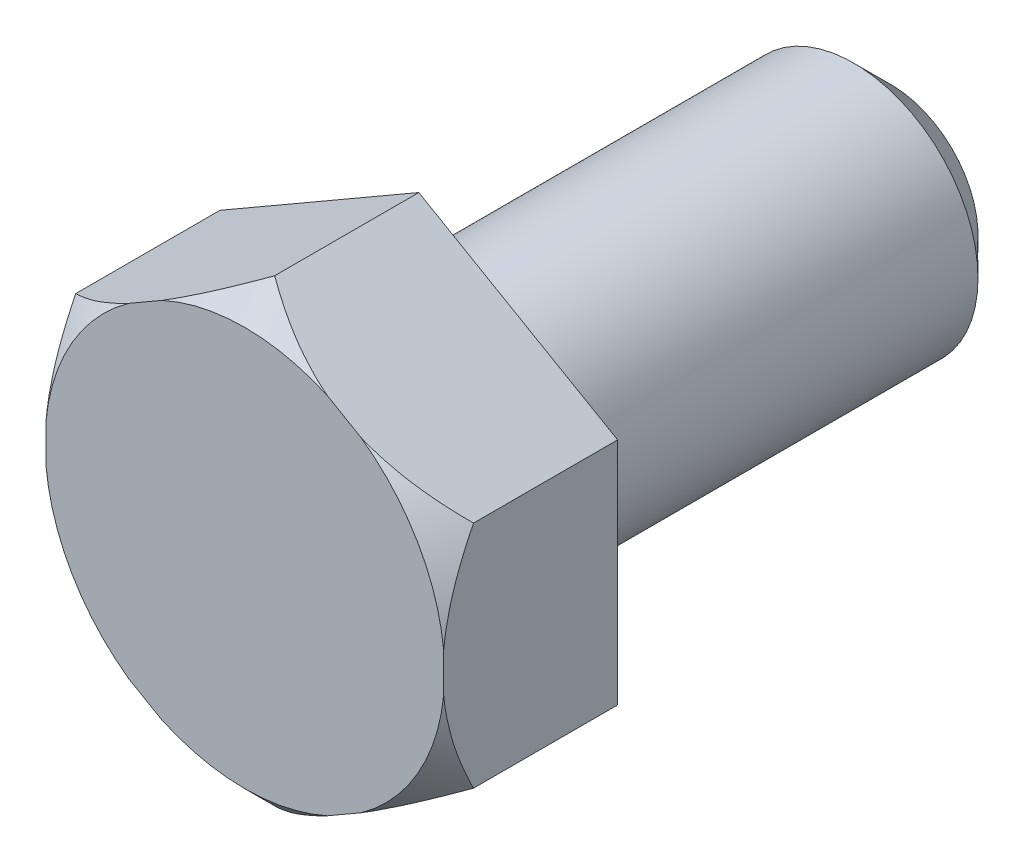
ISO-10303-21;
HEADER;
FILE_DESCRIPTION(('STEP AP214'),'2;1');
FILE_NAME('part.step','',(''),(''),'','','');
FILE_SCHEMA(('AUTOMOTIVE_DESIGN { 1 0 10303 214 1 1 1 1 }'));
ENDSEC;
DATA;
#1=APPLICATION_CONTEXT('core data for automotive mechanical design processes');
#2=APPLICATION_PROTOCOL_DEFINITION('international standard','automotive_design',2000,#1);
#3=PRODUCT_CONTEXT('',#1,'mechanical');
#4=PRODUCT('Part','Part','',(#3));
#5=PRODUCT_RELATED_PRODUCT_CATEGORY('part','',(#4));
#6=PRODUCT_DEFINITION_FORMATION('','',#4);
#7=PRODUCT_DEFINITION_CONTEXT('part definition',#1,'design');
#8=PRODUCT_DEFINITION('design','',#6,#7);
#9=PRODUCT_DEFINITION_SHAPE('','',#8);
#10=(LENGTH_UNIT() NAMED_UNIT(*) SI_UNIT(.MILLI.,.METRE.));
#11=(NAMED_UNIT(*) PLANE_ANGLE_UNIT() SI_UNIT($,.RADIAN.));
#12=(NAMED_UNIT(*) SI_UNIT($,.STERADIAN.) SOLID_ANGLE_UNIT());
#13=UNCERTAINTY_MEASURE_WITH_UNIT(LENGTH_MEASURE(1.E-05),#10,'distance_accuracy_value','');
#14=(GEOMETRIC_REPRESENTATION_CONTEXT(3) GLOBAL_UNCERTAINTY_ASSIGNED_CONTEXT((#13)) GLOBAL_UNIT_ASSIGNED_CONTEXT((#10,
#11,#12)) REPRESENTATION_CONTEXT('',''));
#15=CARTESIAN_POINT('',(0.,0.,0.));
#16=DIRECTION('',(0.,0.,1.));
#17=DIRECTION('',(1.,0.,0.));
#18=AXIS2_PLACEMENT_3D('',#15,#16,#17);
#19=CARTESIAN_POINT('',(4.,2.3094010767585,3.5));
#20=DIRECTION('',(-0.5,-0.866025403784439,0.));
#21=DIRECTION('',(0.866025403784439,-0.5,0.));
#22=AXIS2_PLACEMENT_3D('',#19,#20,#21);
#23=PLANE('',#22);
#24=CARTESIAN_POINT('',(6.79476615595337,0.695842084296772,0.688498842508936));
#25=CARTESIAN_POINT('',(6.70000930950614,0.750549975100642,0.777178889698006));
#26=CARTESIAN_POINT('',(6.60487696818238,0.805474657972554,0.865328805815428));
#27=CARTESIAN_POINT('',(6.41373130740638,0.915832656676006,1.04036549943733));
#28=CARTESIAN_POINT('',(6.31771790950577,0.971266017799732,1.12725216264761));
#29=CARTESIAN_POINT('',(6.12446943592377,1.08283807604278,1.29974670383616));
#30=CARTESIAN_POINT('',(6.02723201228358,1.13897812875675,1.3853510809342));
#31=CARTESIAN_POINT('',(5.83161129676517,1.25191980152038,1.55479243710794));
#32=CARTESIAN_POINT('',(5.73322803576278,1.30872140374386,1.63862946363658));
#33=CARTESIAN_POINT('',(5.53240733494921,1.42466528941742,1.80647993203772));
#34=CARTESIAN_POINT('',(5.42993290458804,1.48382892937149,1.89043450768313));
#35=CARTESIAN_POINT('',(5.22336762687931,1.60308944806186,2.05564703273477));
#36=CARTESIAN_POINT('',(5.11927684103641,1.66318629128842,2.13690508438033));
#37=CARTESIAN_POINT('',(4.90930432500162,1.78441397994353,2.296059302661));
#38=CARTESIAN_POINT('',(4.80342418614574,1.84554390661381,2.37395825807572));
#39=CARTESIAN_POINT('',(4.58950641557992,1.96904938903442,2.52568435543538));
#40=CARTESIAN_POINT('',(4.48146905777372,2.03142478664637,2.59951200989462));
#41=CARTESIAN_POINT('',(4.26003493090071,2.15926983940428,2.74398038586472));
#42=CARTESIAN_POINT('',(4.14657191939889,2.22477773963792,2.81448663246692));
#43=CARTESIAN_POINT('',(3.9166598559198,2.35751753137751,2.94879092757608));
#44=CARTESIAN_POINT('',(3.80021038046368,2.42474966737909,3.01258801811329));
#45=CARTESIAN_POINT('',(3.56470492494815,2.56071880551661,3.13137401588992));
#46=CARTESIAN_POINT('',(3.4456664125482,2.62944572269465,3.1864086204148));
#47=CARTESIAN_POINT('',(3.20431828364179,2.76878812988718,3.28596217144072));
#48=CARTESIAN_POINT('',(3.08200966935891,2.83940304126761,3.3304842996045));
#49=CARTESIAN_POINT('',(2.85867948034043,2.9683427860156,3.39923411057011));
#50=CARTESIAN_POINT('',(2.75818433873892,3.02636368307148,3.42572915166482));
#51=CARTESIAN_POINT('',(2.55566412494509,3.14328878302169,3.46929589304856));
#52=CARTESIAN_POINT('',(2.45363927724055,3.20219285630793,3.48636896239549));
#53=CARTESIAN_POINT('',(2.24886078375985,3.32042177464326,3.5102149877651));
#54=CARTESIAN_POINT('',(2.1461087531537,3.3797456871735,3.51700617374364));
#55=CARTESIAN_POINT('',(1.94048660436699,3.49846169012686,3.51997326136445));
#56=CARTESIAN_POINT('',(1.83761648501932,3.55785378122381,3.51614905717223));
#57=CARTESIAN_POINT('',(1.63284237937224,3.67608016624221,3.49812146490399));
#58=CARTESIAN_POINT('',(1.53093657012821,3.73491551264124,3.48394524346901));
#59=CARTESIAN_POINT('',(1.32847344421937,3.85180765288568,3.44597172288278));
#60=CARTESIAN_POINT('',(1.22791645295816,3.90986425885924,3.42217214373416));
#61=CARTESIAN_POINT('',(1.02833782876811,4.02509103125986,3.36593528936384));
#62=CARTESIAN_POINT('',(0.929321612705897,4.08225807025752,3.33347269032111));
#63=CARTESIAN_POINT('',(0.733368076426664,4.19539189717699,3.26114482396495));
#64=CARTESIAN_POINT('',(0.636430659316713,4.25135874103997,3.22127990251436));
#65=CARTESIAN_POINT('',(0.410702029931545,4.3816832259793,3.12008468151808));
#66=CARTESIAN_POINT('',(0.282789045109983,4.45553382219888,3.05615257560101));
#67=CARTESIAN_POINT('',(0.0305742576020006,4.60115009766022,2.91934821347807));
#68=CARTESIAN_POINT('',(-0.0937255940730358,4.67291465048503,2.84647123421822));
#69=CARTESIAN_POINT('',(-0.33932165060919,4.81470959983809,2.69363109681433));
#70=CARTESIAN_POINT('',(-0.460611085966398,4.88473608799143,2.61365354526049));
#71=CARTESIAN_POINT('',(-0.700341416762302,5.02314445900936,2.4482849873107));
#72=CARTESIAN_POINT('',(-0.818782807502472,5.09152662783639,2.36289493172991));
#73=CARTESIAN_POINT('',(-1.05380077504799,5.2272143146632,2.18743214406013));
#74=CARTESIAN_POINT('',(-1.17036619922115,5.29451339368778,2.09733958859257));
#75=CARTESIAN_POINT('',(-1.401448302179,5.42792870803539,1.91370612321396));
#76=CARTESIAN_POINT('',(-1.51596480893443,5.4940448440373,1.82016492575063));
#77=CARTESIAN_POINT('',(-1.74312962952717,5.62519851435693,1.63040915873426));
#78=CARTESIAN_POINT('',(-1.85577983998467,5.69023714368883,1.53419760780065));
#79=CARTESIAN_POINT('',(-2.07960308284001,5.81946155320226,1.33950918066551));
#80=CARTESIAN_POINT('',(-2.19077608463863,5.88364731571731,1.24103225765361));
#81=CARTESIAN_POINT('',(-2.38440042361704,5.99543637994816,1.06690301959028));
#82=CARTESIAN_POINT('',(-2.46712669446055,6.04319841468872,0.991657221213363));
#83=CARTESIAN_POINT('',(-2.63158175091155,6.1381465858003,0.840569635092686));
#84=CARTESIAN_POINT('',(-2.71331331369694,6.18533432557573,0.764731879594086));
#85=CARTESIAN_POINT('',(-2.79476615595337,6.23236114597874,0.688498842508936));
#86=B_SPLINE_CURVE_WITH_KNOTS('',3,(#24,#25,#26,#27,#28,#29,#30,#31,#32,#33,#34,#35,#36,#37,#38,
#39,#40,#41,#42,#43,#44,#45,#46,#47,#48,#49,#50,#51,#52,#53,#54,#55,#56,#57,#58,#59,#60,#61,#62,
#63,#64,#65,#66,#67,#68,#69,#70,#71,#72,#73,#74,#75,#76,#77,#78,#79,#80,#81,#82,#83,#84,#85),
.UNSPECIFIED.,.F.,.F.,(4,2,2,2,2,2,2,2,2,2,2,2,2,2,2,2,2,2,2,2,2,2,2,2,2,2,2,2,2,2,4),(0.,
0.422523486268595,0.845084965857707,1.26864344611915,1.69219053941843,2.12741530840039,
2.56262355683649,2.99746324351266,3.43224806500054,3.87844266671117,4.32470089225512,
4.76854968510423,5.21226397182493,5.56900884091926,5.92570185960707,6.28176171176553,
6.63782511382167,6.99295744690877,7.3481739684557,7.70444045781147,8.06069030531606,
8.54311709558823,9.02579972065671,9.50948415192898,9.9930838485381,10.4789192678291,
10.9647952887419,11.450142801227,11.9355003516845,12.3002974848988,12.6635031299856),.UNSPECIFIED.);
#87=CARTESIAN_POINT('',(4.,2.3094010767585,2.9));
#88=VERTEX_POINT('',#87);
#89=CARTESIAN_POINT('',(2.33627081621023,3.26995556887816,3.5));
#90=VERTEX_POINT('',#89);
#91=EDGE_CURVE('E120',#88,#90,#86,.T.);
#92=ORIENTED_EDGE('',*,*,#91,.F.);
#93=DIRECTION('',(0.,0.,-1.));
#94=VECTOR('',#93,1.);
#95=CARTESIAN_POINT('',(4.,2.3094010767585,3.5));
#96=LINE('',#95,#94);
#97=CARTESIAN_POINT('',(4.,2.3094010767585,0.));
#98=VERTEX_POINT('',#97);
#99=EDGE_CURVE('E131',#88,#98,#96,.T.);
#100=ORIENTED_EDGE('',*,*,#99,.T.);
#101=DIRECTION('',(-0.866025403784439,0.5,0.));
#102=VECTOR('',#101,1.);
#103=CARTESIAN_POINT('',(4.,2.3094010767585,0.));
#104=LINE('',#103,#102);
#105=CARTESIAN_POINT('',(0.,4.61880215351701,0.));
#106=VERTEX_POINT('',#105);
#107=EDGE_CURVE('E210',#98,#106,#104,.T.);
#108=ORIENTED_EDGE('',*,*,#107,.T.);
#109=DIRECTION('',(0.,0.,-1.));
#110=VECTOR('',#109,1.);
#111=CARTESIAN_POINT('',(0.,4.61880215351701,3.5));
#112=LINE('',#111,#110);
#113=CARTESIAN_POINT('',(0.,4.61880215351701,2.9));
#114=VERTEX_POINT('',#113);
#115=EDGE_CURVE('E156',#114,#106,#112,.T.);
#116=ORIENTED_EDGE('',*,*,#115,.F.);
#117=CARTESIAN_POINT('',(1.66372918378976,3.65824766139735,3.5));
#118=VERTEX_POINT('',#117);
#119=EDGE_CURVE('E137',#118,#114,#86,.T.);
#120=ORIENTED_EDGE('',*,*,#119,.F.);
#121=DIRECTION('',(-0.866025403784439,0.5,0.));
#122=VECTOR('',#121,1.);
#123=CARTESIAN_POINT('',(4.,2.3094010767585,3.5));
#124=LINE('',#123,#122);
#125=EDGE_CURVE('E135',#90,#118,#124,.T.);
#126=ORIENTED_EDGE('',*,*,#125,.F.);
#127=EDGE_LOOP('',(#92,#100,#108,#116,#120,#126));
#128=FACE_BOUND('',#127,.T.);
#129=ADVANCED_FACE('F29',(#128),#23,.F.);
#130=CARTESIAN_POINT('',(0.,4.61880215351701,3.5));
#131=DIRECTION('',(0.5,-0.866025403784438,0.));
#132=DIRECTION('',(0.866025403784439,0.5,0.));
#133=AXIS2_PLACEMENT_3D('',#130,#131,#132);
#134=PLANE('',#133);
#135=CARTESIAN_POINT('',(2.79476615595337,6.23236114597874,0.688498842508935));
#136=CARTESIAN_POINT('',(2.70000930950614,6.17765325517487,0.777178889698004));
#137=CARTESIAN_POINT('',(2.60487696818238,6.12272857230296,0.865328805815427));
#138=CARTESIAN_POINT('',(2.41373130740638,6.01237057359951,1.04036549943733));
#139=CARTESIAN_POINT('',(2.31771790950577,5.95693721247578,1.12725216264761));
#140=CARTESIAN_POINT('',(2.12446943592377,5.84536515423273,1.29974670383616));
#141=CARTESIAN_POINT('',(2.02723201228359,5.78922510151876,1.3853510809342));
#142=CARTESIAN_POINT('',(1.83161129676517,5.67628342875514,1.55479243710794));
#143=CARTESIAN_POINT('',(1.73322803576278,5.61948182653165,1.63862946363657));
#144=CARTESIAN_POINT('',(1.53240733494921,5.50353794085809,1.80647993203772));
#145=CARTESIAN_POINT('',(1.42993290458804,5.44437430090402,1.89043450768313));
#146=CARTESIAN_POINT('',(1.22336762687931,5.32511378221365,2.05564703273477));
#147=CARTESIAN_POINT('',(1.11927684103641,5.26501693898709,2.13690508438033));
#148=CARTESIAN_POINT('',(0.909304325001625,5.14378925033199,2.296059302661));
#149=CARTESIAN_POINT('',(0.803424186145741,5.08265932366171,2.37395825807572));
#150=CARTESIAN_POINT('',(0.589506415579928,4.95915384124109,2.52568435543538));
#151=CARTESIAN_POINT('',(0.481469057773723,4.89677844362914,2.59951200989462));
#152=CARTESIAN_POINT('',(0.260034930900709,4.76893339087124,2.74398038586472));
#153=CARTESIAN_POINT('',(0.146571919398891,4.7034254906376,2.81448663246692));
#154=CARTESIAN_POINT('',(-0.0833401440801969,4.570685698898,2.94879092757608));
#155=CARTESIAN_POINT('',(-0.199789619536315,4.50345356289642,3.01258801811329));
#156=CARTESIAN_POINT('',(-0.435295075051851,4.3674844247589,3.13137401588992));
#157=CARTESIAN_POINT('',(-0.554333587451798,4.29875750758086,3.1864086204148));
#158=CARTESIAN_POINT('',(-0.795681716358207,4.15941510038833,3.28596217144072));
#159=CARTESIAN_POINT('',(-0.917990330641092,4.0888001890079,3.3304842996045));
#160=CARTESIAN_POINT('',(-1.14132051965957,3.95986044425991,3.39923411057011));
#161=CARTESIAN_POINT('',(-1.24181566126108,3.90183954720403,3.42572915166482));
#162=CARTESIAN_POINT('',(-1.44433587505491,3.78491444725382,3.46929589304856));
#163=CARTESIAN_POINT('',(-1.54636072275944,3.72601037396758,3.48636896239549));
#164=CARTESIAN_POINT('',(-1.75113921624014,3.60778145563225,3.5102149877651));
#165=CARTESIAN_POINT('',(-1.85389124684629,3.54845754310201,3.51700617374364));
#166=CARTESIAN_POINT('',(-2.059513395633,3.42974154014865,3.51997326136445));
#167=CARTESIAN_POINT('',(-2.16238351498068,3.3703494490517,3.51614905717223));
#168=CARTESIAN_POINT('',(-2.36715762062776,3.2521230640333,3.49812146490399));
#169=CARTESIAN_POINT('',(-2.46906342987178,3.19328771763427,3.48394524346901));
#170=CARTESIAN_POINT('',(-2.67152655578062,3.07639557738983,3.44597172288278));
#171=CARTESIAN_POINT('',(-2.77208354704184,3.01833897141627,3.42217214373416));
#172=CARTESIAN_POINT('',(-2.97166217123189,2.90311219901565,3.36593528936385));
#173=CARTESIAN_POINT('',(-3.0706783872941,2.84594516001799,3.33347269032111));
#174=CARTESIAN_POINT('',(-3.26663192357333,2.73281133309852,3.26114482396495));
#175=CARTESIAN_POINT('',(-3.36356934068328,2.67684448923554,3.22127990251437));
#176=CARTESIAN_POINT('',(-3.58929797006845,2.54652000429621,3.12008468151809));
#177=CARTESIAN_POINT('',(-3.71721095489001,2.47266940807663,3.05615257560101));
#178=CARTESIAN_POINT('',(-3.96942574239799,2.32705313261529,2.91934821347808));
#179=CARTESIAN_POINT('',(-4.09372559407303,2.25528857979048,2.84647123421822));
#180=CARTESIAN_POINT('',(-4.33932165060918,2.11349363043742,2.69363109681434));
#181=CARTESIAN_POINT('',(-4.46061108596639,2.04346714228408,2.61365354526049));
#182=CARTESIAN_POINT('',(-4.70034141676229,1.90505877126615,2.4482849873107));
#183=CARTESIAN_POINT('',(-4.81878280750246,1.83667660243912,2.36289493172991));
#184=CARTESIAN_POINT('',(-5.05380077504798,1.70098891561231,2.18743214406013));
#185=CARTESIAN_POINT('',(-5.17036619922115,1.63368983658773,2.09733958859257));
#186=CARTESIAN_POINT('',(-5.40144830217899,1.50027452224012,1.91370612321397));
#187=CARTESIAN_POINT('',(-5.51596480893442,1.43415838623821,1.82016492575063));
#188=CARTESIAN_POINT('',(-5.74312962952716,1.30300471591858,1.63040915873427));
#189=CARTESIAN_POINT('',(-5.85577983998466,1.23796608658668,1.53419760780066));
#190=CARTESIAN_POINT('',(-6.07960308284,1.10874167707325,1.33950918066552));
#191=CARTESIAN_POINT('',(-6.19077608463861,1.0445559145582,1.24103225765362));
#192=CARTESIAN_POINT('',(-6.38440042361703,0.932766850327349,1.06690301959029));
#193=CARTESIAN_POINT('',(-6.46712669446054,0.885004815586794,0.991657221213369));
#194=CARTESIAN_POINT('',(-6.63158175091155,0.790056644475211,0.840569635092688));
#195=CARTESIAN_POINT('',(-6.71331331369694,0.742868904699777,0.764731879594086));
#196=CARTESIAN_POINT('',(-6.79476615595337,0.695842084296767,0.688498842508936));
#197=B_SPLINE_CURVE_WITH_KNOTS('',3,(#135,#136,#137,#138,#139,#140,#141,#142,#143,#144,#145,
#146,#147,#148,#149,#150,#151,#152,#153,#154,#155,#156,#157,#158,#159,#160,#161,#162,#163,#164,
#165,#166,#167,#168,#169,#170,#171,#172,#173,#174,#175,#176,#177,#178,#179,#180,#181,#182,#183,
#184,#185,#186,#187,#188,#189,#190,#191,#192,#193,#194,#195,#196),.UNSPECIFIED.,.F.,.F.,(4,2,2,
2,2,2,2,2,2,2,2,2,2,2,2,2,2,2,2,2,2,2,2,2,2,2,2,2,2,2,4),(0.,0.422523486268594,
0.845084965857706,1.26864344611915,1.69219053941843,2.12741530840039,2.56262355683649,
2.99746324351266,3.43224806500054,3.87844266671116,4.32470089225512,4.76854968510423,
5.21226397182493,5.56900884091926,5.92570185960707,6.28176171176553,6.63782511382167,
6.99295744690877,7.3481739684557,7.70444045781147,8.06069030531606,8.54311709558823,
9.02579972065671,9.50948415192898,9.9930838485381,10.4789192678291,10.9647952887419,
11.450142801227,11.9355003516845,12.3002974848988,12.6635031299856),.UNSPECIFIED.);
#198=CARTESIAN_POINT('',(-1.66372918378976,3.65824766139735,3.5));
#199=VERTEX_POINT('',#198);
#200=EDGE_CURVE('E218',#114,#199,#197,.T.);
#201=ORIENTED_EDGE('',*,*,#200,.F.);
#202=ORIENTED_EDGE('',*,*,#115,.T.);
#203=DIRECTION('',(-0.866025403784438,-0.5,0.));
#204=VECTOR('',#203,1.);
#205=CARTESIAN_POINT('',(0.,4.61880215351701,0.));
#206=LINE('',#205,#204);
#207=CARTESIAN_POINT('',(-4.,2.3094010767585,0.));
#208=VERTEX_POINT('',#207);
#209=EDGE_CURVE('E207',#106,#208,#206,.T.);
#210=ORIENTED_EDGE('',*,*,#209,.T.);
#211=DIRECTION('',(0.,0.,-1.));
#212=VECTOR('',#211,1.);
#213=CARTESIAN_POINT('',(-4.,2.3094010767585,3.5));
#214=LINE('',#213,#212);
#215=CARTESIAN_POINT('',(-4.,2.3094010767585,2.9));
#216=VERTEX_POINT('',#215);
#217=EDGE_CURVE('E154',#216,#208,#214,.T.);
#218=ORIENTED_EDGE('',*,*,#217,.F.);
#219=CARTESIAN_POINT('',(-2.33627081621024,3.26995556887815,3.5));
#220=VERTEX_POINT('',#219);
#221=EDGE_CURVE('E212',#220,#216,#197,.T.);
#222=ORIENTED_EDGE('',*,*,#221,.F.);
#223=DIRECTION('',(-0.866025403784438,-0.5,0.));
#224=VECTOR('',#223,1.);
#225=CARTESIAN_POINT('',(0.,4.61880215351701,3.5));
#226=LINE('',#225,#224);
#227=EDGE_CURVE('E194',#199,#220,#226,.T.);
#228=ORIENTED_EDGE('',*,*,#227,.F.);
#229=EDGE_LOOP('',(#201,#202,#210,#218,#222,#228));
#230=FACE_BOUND('',#229,.T.);
#231=ADVANCED_FACE('F226',(#230),#134,.F.);
#232=CARTESIAN_POINT('',(-4.,2.3094010767585,3.5));
#233=DIRECTION('',(1.,0.,0.));
#234=DIRECTION('',(0.,1.,0.));
#235=AXIS2_PLACEMENT_3D('',#232,#233,#234);
#236=PLANE('',#235);
#237=CARTESIAN_POINT('',(-4.,5.10416723271187,1.03401047301642));
#238=CARTESIAN_POINT('',(-4.,4.9898588262799,1.12396648712248));
#239=CARTESIAN_POINT('',(-4.,4.87500222403636,1.21323480572489));
#240=CARTESIAN_POINT('',(-4.,4.64398100830827,1.39010065461611));
#241=CARTESIAN_POINT('',(-4.,4.52781618373569,1.47769790894519));
#242=CARTESIAN_POINT('',(-4.,4.29341594348141,1.6513323356686));
#243=CARTESIAN_POINT('',(-4.,4.17517305003121,1.73735943976961));
#244=CARTESIAN_POINT('',(-4.,3.93695487059267,1.90697407264146));
#245=CARTESIAN_POINT('',(-4.,3.81697966748713,1.99056171755454));
#246=CARTESIAN_POINT('',(-4.,3.56903053988056,2.15883212778891));
#247=CARTESIAN_POINT('',(-4.,3.44095437037389,2.24336480540375));
#248=CARTESIAN_POINT('',(-4.,3.18221357615381,2.40836670985872));
#249=CARTESIAN_POINT('',(-4.,3.05154916715139,2.48883627336257));
#250=CARTESIAN_POINT('',(-4.,2.7874476092969,2.6445324081336));
#251=CARTESIAN_POINT('',(-4.,2.65401614902953,2.71976857302015));
#252=CARTESIAN_POINT('',(-4.,2.38373289021929,2.86379345674663));
#253=CARTESIAN_POINT('',(-4.,2.24688202766041,2.93258391598543));
#254=CARTESIAN_POINT('',(-4.,1.98367043923717,3.05530153135103));
#255=CARTESIAN_POINT('',(-4.,1.85768607919076,3.11002999939294));
#256=CARTESIAN_POINT('',(-4.,1.60243753593935,3.21135635365713));
#257=CARTESIAN_POINT('',(-4.,1.47317303987091,3.25795346093595));
#258=CARTESIAN_POINT('',(-4.,1.21292441705818,3.34074586733072));
#259=CARTESIAN_POINT('',(-4.,1.08197637095356,3.37705304471776));
#260=CARTESIAN_POINT('',(-4.,0.817433071402948,3.43815768072446));
#261=CARTESIAN_POINT('',(-4.,0.683838902497328,3.46295975705223));
#262=CARTESIAN_POINT('',(-4.,0.412316048728752,3.49989685857687));
#263=CARTESIAN_POINT('',(-4.,0.274353076380333,3.51178529673611));
#264=CARTESIAN_POINT('',(-4.,-0.00205892664185706,3.52118634522706));
#265=CARTESIAN_POINT('',(-4.,-0.140507912440202,3.51870024964367));
#266=CARTESIAN_POINT('',(-4.,-0.416814625689941,3.49951454323253));
#267=CARTESIAN_POINT('',(-4.,-0.554669343917948,3.48277242008026));
#268=CARTESIAN_POINT('',(-4.,-0.828137115961054,3.43620184928348));
#269=CARTESIAN_POINT('',(-4.,-0.963749558031617,3.40636988962308));
#270=CARTESIAN_POINT('',(-4.,-1.27307598794308,3.32450160228564));
#271=CARTESIAN_POINT('',(-4.,-1.44572159053212,3.26846152909961));
#272=CARTESIAN_POINT('',(-4.,-1.78533180367642,3.14129797447849));
#273=CARTESIAN_POINT('',(-4.,-1.95229295544584,3.07016549368022));
#274=CARTESIAN_POINT('',(-4.,-2.28202183378059,2.915951609777));
#275=CARTESIAN_POINT('',(-4.,-2.44474983911879,2.83278642195294));
#276=CARTESIAN_POINT('',(-4.,-2.76538092127963,2.65780460696018));
#277=CARTESIAN_POINT('',(-4.,-2.92328510556265,2.56598998561201));
#278=CARTESIAN_POINT('',(-4.,-3.25793446497207,2.36185945664941));
#279=CARTESIAN_POINT('',(-4.,-3.43404610324972,2.24851177217482));
#280=CARTESIAN_POINT('',(-4.,-3.78201930426931,2.01543949003394));
#281=CARTESIAN_POINT('',(-4.,-3.95387990035834,1.89571346115211));
#282=CARTESIAN_POINT('',(-4.,-4.29033684017848,1.65419733400948));
#283=CARTESIAN_POINT('',(-4.,-4.45500968062294,1.53251336835331));
#284=CARTESIAN_POINT('',(-4.,-4.69993893406992,1.34736923817687));
#285=CARTESIAN_POINT('',(-4.,-4.78120758789535,1.28524011601032));
#286=CARTESIAN_POINT('',(-4.,-4.94313113165496,1.16019346744187));
#287=CARTESIAN_POINT('',(-4.,-5.02378604589967,1.09727597253186));
#288=CARTESIAN_POINT('',(-4.,-5.10416723271188,1.03401047301642));
#289=B_SPLINE_CURVE_WITH_KNOTS('',3,(#237,#238,#239,#240,#241,#242,#243,#244,#245,#246,#247,
#248,#249,#250,#251,#252,#253,#254,#255,#256,#257,#258,#259,#260,#261,#262,#263,#264,#265,#266,
#267,#268,#269,#270,#271,#272,#273,#274,#275,#276,#277,#278,#279,#280,#281,#282,#283,#284,#285,
#286,#287,#288),.UNSPECIFIED.,.F.,.F.,(4,2,2,2,2,2,2,2,2,2,2,2,2,2,2,2,2,2,2,2,2,2,2,2,2,4),(0.,
0.436384342617494,0.872840136625534,1.31149215989666,1.75012326483772,2.2104351547303,
2.67070884105001,3.13011523708763,3.58939722962065,4.00124375002808,4.41312970162891,
4.8203486590927,5.22740403270317,5.64210248176473,6.05676359767511,6.47266560576147,
6.88867926905835,7.43226364876331,7.97617307474041,8.52407040356244,9.07184098523918,
9.6999549943043,10.3282105423314,10.9424080819961,11.2492945354684,11.5561687690673),.UNSPECIFIED.);
#290=CARTESIAN_POINT('',(-4.,0.388292092519187,3.5));
#291=VERTEX_POINT('',#290);
#292=EDGE_CURVE('E219',#216,#291,#289,.T.);
#293=ORIENTED_EDGE('',*,*,#292,.F.);
#294=ORIENTED_EDGE('',*,*,#217,.T.);
#295=DIRECTION('',(0.,-1.,0.));
#296=VECTOR('',#295,1.);
#297=CARTESIAN_POINT('',(-4.,2.3094010767585,0.));
#298=LINE('',#297,#296);
#299=CARTESIAN_POINT('',(-4.,-2.3094010767585,0.));
#300=VERTEX_POINT('',#299);
#301=EDGE_CURVE('E204',#208,#300,#298,.T.);
#302=ORIENTED_EDGE('',*,*,#301,.T.);
#303=DIRECTION('',(0.,0.,-1.));
#304=VECTOR('',#303,1.);
#305=CARTESIAN_POINT('',(-4.,-2.3094010767585,3.5));
#306=LINE('',#305,#304);
#307=CARTESIAN_POINT('',(-4.,-2.3094010767585,2.9));
#308=VERTEX_POINT('',#307);
#309=EDGE_CURVE('E152',#308,#300,#306,.T.);
#310=ORIENTED_EDGE('',*,*,#309,.F.);
#311=CARTESIAN_POINT('',(-4.,-0.38829209251919,3.5));
#312=VERTEX_POINT('',#311);
#313=EDGE_CURVE('E220',#312,#308,#289,.T.);
#314=ORIENTED_EDGE('',*,*,#313,.F.);
#315=DIRECTION('',(0.,-1.,0.));
#316=VECTOR('',#315,1.);
#317=CARTESIAN_POINT('',(-4.,2.3094010767585,3.5));
#318=LINE('',#317,#316);
#319=EDGE_CURVE('E190',#291,#312,#318,.T.);
#320=ORIENTED_EDGE('',*,*,#319,.F.);
#321=EDGE_LOOP('',(#293,#294,#302,#310,#314,#320));
#322=FACE_BOUND('',#321,.T.);
#323=ADVANCED_FACE('F265',(#322),#236,.F.);
#324=CARTESIAN_POINT('',(-4.,-2.3094010767585,3.5));
#325=DIRECTION('',(0.5,0.866025403784439,0.));
#326=DIRECTION('',(-0.866025403784439,0.5,0.));
#327=AXIS2_PLACEMENT_3D('',#324,#325,#326);
#328=PLANE('',#327);
#329=CARTESIAN_POINT('',(-6.79476615595337,-0.695842084296771,0.688498842508936));
#330=CARTESIAN_POINT('',(-6.70000930950614,-0.75054997510064,0.777178889698006));
#331=CARTESIAN_POINT('',(-6.60487696818238,-0.805474657972552,0.865328805815428));
#332=CARTESIAN_POINT('',(-6.41373130740638,-0.915832656676005,1.04036549943733));
#333=CARTESIAN_POINT('',(-6.31771790950577,-0.971266017799731,1.12725216264761));
#334=CARTESIAN_POINT('',(-6.12446943592377,-1.08283807604278,1.29974670383617));
#335=CARTESIAN_POINT('',(-6.02723201228358,-1.13897812875675,1.3853510809342));
#336=CARTESIAN_POINT('',(-5.83161129676517,-1.25191980152037,1.55479243710794));
#337=CARTESIAN_POINT('',(-5.73322803576278,-1.30872140374386,1.63862946363658));
#338=CARTESIAN_POINT('',(-5.53240733494921,-1.42466528941742,1.80647993203772));
#339=CARTESIAN_POINT('',(-5.42993290458804,-1.48382892937149,1.89043450768313));
#340=CARTESIAN_POINT('',(-5.22336762687931,-1.60308944806186,2.05564703273477));
#341=CARTESIAN_POINT('',(-5.11927684103641,-1.66318629128842,2.13690508438033));
#342=CARTESIAN_POINT('',(-4.90930432500162,-1.78441397994353,2.296059302661));
#343=CARTESIAN_POINT('',(-4.80342418614574,-1.84554390661381,2.37395825807572));
#344=CARTESIAN_POINT('',(-4.58950641557992,-1.96904938903442,2.52568435543539));
#345=CARTESIAN_POINT('',(-4.48146905777372,-2.03142478664637,2.59951200989463));
#346=CARTESIAN_POINT('',(-4.2600349309007,-2.15926983940428,2.74398038586472));
#347=CARTESIAN_POINT('',(-4.14657191939889,-2.22477773963792,2.81448663246692));
#348=CARTESIAN_POINT('',(-3.9166598559198,-2.35751753137751,2.94879092757608));
#349=CARTESIAN_POINT('',(-3.80021038046368,-2.42474966737909,3.01258801811329));
#350=CARTESIAN_POINT('',(-3.56470492494814,-2.56071880551661,3.13137401588993));
#351=CARTESIAN_POINT('',(-3.4456664125482,-2.62944572269465,3.1864086204148));
#352=CARTESIAN_POINT('',(-3.20431828364179,-2.76878812988718,3.28596217144072));
#353=CARTESIAN_POINT('',(-3.0820096693589,-2.83940304126761,3.3304842996045));
#354=CARTESIAN_POINT('',(-2.85867948034043,-2.9683427860156,3.39923411057011));
#355=CARTESIAN_POINT('',(-2.75818433873892,-3.02636368307148,3.42572915166482));
#356=CARTESIAN_POINT('',(-2.55566412494509,-3.14328878302169,3.46929589304856));
#357=CARTESIAN_POINT('',(-2.45363927724055,-3.20219285630793,3.48636896239549));
#358=CARTESIAN_POINT('',(-2.24886078375985,-3.32042177464326,3.5102149877651));
#359=CARTESIAN_POINT('',(-2.1461087531537,-3.3797456871735,3.51700617374364));
#360=CARTESIAN_POINT('',(-1.94048660436699,-3.49846169012686,3.51997326136445));
#361=CARTESIAN_POINT('',(-1.83761648501932,-3.55785378122381,3.51614905717223));
#362=CARTESIAN_POINT('',(-1.63284237937224,-3.67608016624221,3.49812146490399));
#363=CARTESIAN_POINT('',(-1.53093657012821,-3.73491551264124,3.48394524346901));
#364=CARTESIAN_POINT('',(-1.32847344421937,-3.85180765288568,3.44597172288278));
#365=CARTESIAN_POINT('',(-1.22791645295816,-3.90986425885924,3.42217214373416));
#366=CARTESIAN_POINT('',(-1.02833782876811,-4.02509103125986,3.36593528936384));
#367=CARTESIAN_POINT('',(-0.929321612705898,-4.08225807025752,3.33347269032111));
#368=CARTESIAN_POINT('',(-0.733368076426665,-4.19539189717699,3.26114482396495));
#369=CARTESIAN_POINT('',(-0.636430659316713,-4.25135874103997,3.22127990251436));
#370=CARTESIAN_POINT('',(-0.410702029931545,-4.3816832259793,3.12008468151808));
#371=CARTESIAN_POINT('',(-0.282789045109983,-4.45553382219888,3.05615257560101));
#372=CARTESIAN_POINT('',(-0.0305742576020005,-4.60115009766022,2.91934821347807));
#373=CARTESIAN_POINT('',(0.0937255940730365,-4.67291465048503,2.84647123421822));
#374=CARTESIAN_POINT('',(0.339321650609192,-4.81470959983809,2.69363109681433));
#375=CARTESIAN_POINT('',(0.4606110859664,-4.88473608799143,2.61365354526048));
#376=CARTESIAN_POINT('',(0.700341416762303,-5.02314445900937,2.4482849873107));
#377=CARTESIAN_POINT('',(0.818782807502473,-5.0915266278364,2.3628949317299));
#378=CARTESIAN_POINT('',(1.05380077504799,-5.2272143146632,2.18743214406012));
#379=CARTESIAN_POINT('',(1.17036619922116,-5.29451339368778,2.09733958859257));
#380=CARTESIAN_POINT('',(1.401448302179,-5.4279287080354,1.91370612321396));
#381=CARTESIAN_POINT('',(1.51596480893443,-5.4940448440373,1.82016492575062));
#382=CARTESIAN_POINT('',(1.74312962952717,-5.62519851435693,1.63040915873426));
#383=CARTESIAN_POINT('',(1.85577983998467,-5.69023714368884,1.53419760780065));
#384=CARTESIAN_POINT('',(2.07960308284002,-5.81946155320226,1.33950918066551));
#385=CARTESIAN_POINT('',(2.19077608463863,-5.88364731571731,1.2410322576536));
#386=CARTESIAN_POINT('',(2.38440042361705,-5.99543637994817,1.06690301959028));
#387=CARTESIAN_POINT('',(2.46712669446055,-6.04319841468872,0.99165722121336));
#388=CARTESIAN_POINT('',(2.63158175091156,-6.1381465858003,0.840569635092683));
#389=CARTESIAN_POINT('',(2.71331331369694,-6.18533432557573,0.764731879594083));
#390=CARTESIAN_POINT('',(2.79476615595337,-6.23236114597874,0.688498842508935));
#391=B_SPLINE_CURVE_WITH_KNOTS('',3,(#329,#330,#331,#332,#333,#334,#335,#336,#337,#338,#339,
#340,#341,#342,#343,#344,#345,#346,#347,#348,#349,#350,#351,#352,#353,#354,#355,#356,#357,#358,
#359,#360,#361,#362,#363,#364,#365,#366,#367,#368,#369,#370,#371,#372,#373,#374,#375,#376,#377,
#378,#379,#380,#381,#382,#383,#384,#385,#386,#387,#388,#389,#390),.UNSPECIFIED.,.F.,.F.,(4,2,2,
2,2,2,2,2,2,2,2,2,2,2,2,2,2,2,2,2,2,2,2,2,2,2,2,2,2,2,4),(0.,0.422523486268594,
0.845084965857706,1.26864344611915,1.69219053941843,2.12741530840039,2.56262355683649,
2.99746324351267,3.43224806500054,3.87844266671117,4.32470089225512,4.76854968510423,
5.21226397182493,5.56900884091926,5.92570185960707,6.28176171176554,6.63782511382167,
6.99295744690877,7.34817396845571,7.70444045781147,8.06069030531607,8.54311709558823,
9.02579972065672,9.50948415192899,9.99308384853811,10.4789192678291,10.964795288742,
11.450142801227,11.9355003516845,12.3002974848989,12.6635031299856),.UNSPECIFIED.);
#392=CARTESIAN_POINT('',(-2.33627081621023,-3.26995556887817,3.5));
#393=VERTEX_POINT('',#392);
#394=EDGE_CURVE('E261',#308,#393,#391,.T.);
#395=ORIENTED_EDGE('',*,*,#394,.F.);
#396=ORIENTED_EDGE('',*,*,#309,.T.);
#397=DIRECTION('',(0.866025403784439,-0.5,0.));
#398=VECTOR('',#397,1.);
#399=CARTESIAN_POINT('',(-4.,-2.3094010767585,0.));
#400=LINE('',#399,#398);
#401=CARTESIAN_POINT('',(0.,-4.61880215351701,0.));
#402=VERTEX_POINT('',#401);
#403=EDGE_CURVE('E201',#300,#402,#400,.T.);
#404=ORIENTED_EDGE('',*,*,#403,.T.);
#405=DIRECTION('',(0.,0.,-1.));
#406=VECTOR('',#405,1.);
#407=CARTESIAN_POINT('',(0.,-4.61880215351701,3.5));
#408=LINE('',#407,#406);
#409=CARTESIAN_POINT('',(0.,-4.61880215351701,2.9));
#410=VERTEX_POINT('',#409);
#411=EDGE_CURVE('E145',#410,#402,#408,.T.);
#412=ORIENTED_EDGE('',*,*,#411,.F.);
#413=CARTESIAN_POINT('',(-1.66372918378977,-3.65824766139734,3.5));
#414=VERTEX_POINT('',#413);
#415=EDGE_CURVE('E256',#414,#410,#391,.T.);
#416=ORIENTED_EDGE('',*,*,#415,.F.);
#417=DIRECTION('',(0.866025403784439,-0.5,0.));
#418=VECTOR('',#417,1.);
#419=CARTESIAN_POINT('',(-4.,-2.3094010767585,3.5));
#420=LINE('',#419,#418);
#421=EDGE_CURVE('E182',#393,#414,#420,.T.);
#422=ORIENTED_EDGE('',*,*,#421,.F.);
#423=EDGE_LOOP('',(#395,#396,#404,#412,#416,#422));
#424=FACE_BOUND('',#423,.T.);
#425=ADVANCED_FACE('F262',(#424),#328,.F.);
#426=CARTESIAN_POINT('',(0.,-4.61880215351701,3.5));
#427=DIRECTION('',(-0.5,0.866025403784438,0.));
#428=DIRECTION('',(-0.866025403784439,-0.5,0.));
#429=AXIS2_PLACEMENT_3D('',#426,#427,#428);
#430=PLANE('',#429);
#431=CARTESIAN_POINT('',(-2.79476615595337,-6.23236114597874,0.688498842508934));
#432=CARTESIAN_POINT('',(-2.70000930950614,-6.17765325517487,0.777178889698002));
#433=CARTESIAN_POINT('',(-2.60487696818238,-6.12272857230296,0.865328805815425));
#434=CARTESIAN_POINT('',(-2.41373130740638,-6.01237057359951,1.04036549943733));
#435=CARTESIAN_POINT('',(-2.31771790950577,-5.95693721247578,1.12725216264761));
#436=CARTESIAN_POINT('',(-2.12446943592377,-5.84536515423273,1.29974670383616));
#437=CARTESIAN_POINT('',(-2.02723201228358,-5.78922510151876,1.38535108093419));
#438=CARTESIAN_POINT('',(-1.83161129676517,-5.67628342875514,1.55479243710794));
#439=CARTESIAN_POINT('',(-1.73322803576278,-5.61948182653166,1.63862946363657));
#440=CARTESIAN_POINT('',(-1.53240733494921,-5.50353794085809,1.80647993203772));
#441=CARTESIAN_POINT('',(-1.42993290458804,-5.44437430090402,1.89043450768313));
#442=CARTESIAN_POINT('',(-1.22336762687931,-5.32511378221365,2.05564703273476));
#443=CARTESIAN_POINT('',(-1.11927684103641,-5.26501693898709,2.13690508438032));
#444=CARTESIAN_POINT('',(-0.909304325001626,-5.14378925033199,2.296059302661));
#445=CARTESIAN_POINT('',(-0.803424186145742,-5.08265932366171,2.37395825807572));
#446=CARTESIAN_POINT('',(-0.589506415579929,-4.95915384124109,2.52568435543538));
#447=CARTESIAN_POINT('',(-0.481469057773724,-4.89677844362914,2.59951200989462));
#448=CARTESIAN_POINT('',(-0.260034930900709,-4.76893339087124,2.74398038586472));
#449=CARTESIAN_POINT('',(-0.146571919398892,-4.7034254906376,2.81448663246692));
#450=CARTESIAN_POINT('',(0.0833401440801958,-4.570685698898,2.94879092757608));
#451=CARTESIAN_POINT('',(0.199789619536314,-4.50345356289642,3.01258801811329));
#452=CARTESIAN_POINT('',(0.43529507505185,-4.3674844247589,3.13137401588992));
#453=CARTESIAN_POINT('',(0.554333587451796,-4.29875750758086,3.1864086204148));
#454=CARTESIAN_POINT('',(0.795681716358206,-4.15941510038833,3.28596217144072));
#455=CARTESIAN_POINT('',(0.917990330641091,-4.0888001890079,3.3304842996045));
#456=CARTESIAN_POINT('',(1.14132051965957,-3.95986044425991,3.3992341105701));
#457=CARTESIAN_POINT('',(1.24181566126108,-3.90183954720403,3.42572915166482));
#458=CARTESIAN_POINT('',(1.44433587505491,-3.78491444725382,3.46929589304856));
#459=CARTESIAN_POINT('',(1.54636072275944,-3.72601037396758,3.48636896239549));
#460=CARTESIAN_POINT('',(1.75113921624014,-3.60778145563225,3.5102149877651));
#461=CARTESIAN_POINT('',(1.85389124684629,-3.54845754310201,3.51700617374364));
#462=CARTESIAN_POINT('',(2.059513395633,-3.42974154014865,3.51997326136445));
#463=CARTESIAN_POINT('',(2.16238351498068,-3.3703494490517,3.51614905717223));
#464=CARTESIAN_POINT('',(2.36715762062776,-3.2521230640333,3.49812146490399));
#465=CARTESIAN_POINT('',(2.46906342987178,-3.19328771763427,3.48394524346901));
#466=CARTESIAN_POINT('',(2.67152655578062,-3.07639557738983,3.44597172288278));
#467=CARTESIAN_POINT('',(2.77208354704184,-3.01833897141627,3.42217214373416));
#468=CARTESIAN_POINT('',(2.97166217123189,-2.90311219901565,3.36593528936384));
#469=CARTESIAN_POINT('',(3.0706783872941,-2.84594516001799,3.33347269032111));
#470=CARTESIAN_POINT('',(3.26663192357333,-2.73281133309852,3.26114482396495));
#471=CARTESIAN_POINT('',(3.36356934068328,-2.67684448923554,3.22127990251436));
#472=CARTESIAN_POINT('',(3.58929797006845,-2.54652000429621,3.12008468151808));
#473=CARTESIAN_POINT('',(3.71721095489001,-2.47266940807663,3.05615257560101));
#474=CARTESIAN_POINT('',(3.969425742398,-2.32705313261529,2.91934821347807));
#475=CARTESIAN_POINT('',(4.09372559407303,-2.25528857979048,2.84647123421822));
#476=CARTESIAN_POINT('',(4.33932165060919,-2.11349363043742,2.69363109681434));
#477=CARTESIAN_POINT('',(4.46061108596639,-2.04346714228408,2.61365354526049));
#478=CARTESIAN_POINT('',(4.7003414167623,-1.90505877126615,2.4482849873107));
#479=CARTESIAN_POINT('',(4.81878280750247,-1.83667660243912,2.36289493172991));
#480=CARTESIAN_POINT('',(5.05380077504799,-1.70098891561231,2.18743214406013));
#481=CARTESIAN_POINT('',(5.17036619922115,-1.63368983658773,2.09733958859257));
#482=CARTESIAN_POINT('',(5.40144830217899,-1.50027452224012,1.91370612321397));
#483=CARTESIAN_POINT('',(5.51596480893442,-1.43415838623821,1.82016492575063));
#484=CARTESIAN_POINT('',(5.74312962952716,-1.30300471591858,1.63040915873427));
#485=CARTESIAN_POINT('',(5.85577983998466,-1.23796608658668,1.53419760780066));
#486=CARTESIAN_POINT('',(6.07960308284001,-1.10874167707325,1.33950918066552));
#487=CARTESIAN_POINT('',(6.19077608463862,-1.0445559145582,1.24103225765361));
#488=CARTESIAN_POINT('',(6.38440042361704,-0.932766850327348,1.06690301959029));
#489=CARTESIAN_POINT('',(6.46712669446055,-0.885004815586793,0.991657221213366));
#490=CARTESIAN_POINT('',(6.63158175091155,-0.790056644475211,0.840569635092687));
#491=CARTESIAN_POINT('',(6.71331331369694,-0.742868904699777,0.764731879594085));
#492=CARTESIAN_POINT('',(6.79476615595337,-0.695842084296767,0.688498842508935));
#493=B_SPLINE_CURVE_WITH_KNOTS('',3,(#431,#432,#433,#434,#435,#436,#437,#438,#439,#440,#441,
#442,#443,#444,#445,#446,#447,#448,#449,#450,#451,#452,#453,#454,#455,#456,#457,#458,#459,#460,
#461,#462,#463,#464,#465,#466,#467,#468,#469,#470,#471,#472,#473,#474,#475,#476,#477,#478,#479,
#480,#481,#482,#483,#484,#485,#486,#487,#488,#489,#490,#491,#492),.UNSPECIFIED.,.F.,.F.,(4,2,2,
2,2,2,2,2,2,2,2,2,2,2,2,2,2,2,2,2,2,2,2,2,2,2,2,2,2,2,4),(0.,0.422523486268594,
0.845084965857707,1.26864344611915,1.69219053941843,2.12741530840039,2.56262355683649,
2.99746324351266,3.43224806500054,3.87844266671116,4.32470089225512,4.76854968510423,
5.21226397182493,5.56900884091926,5.92570185960707,6.28176171176553,6.63782511382167,
6.99295744690877,7.34817396845571,7.70444045781147,8.06069030531606,8.54311709558823,
9.02579972065671,9.50948415192898,9.9930838485381,10.4789192678291,10.9647952887419,
11.450142801227,11.9355003516845,12.3002974848988,12.6635031299856),.UNSPECIFIED.);
#494=CARTESIAN_POINT('',(1.66372918378978,-3.65824766139734,3.5));
#495=VERTEX_POINT('',#494);
#496=EDGE_CURVE('E52',#410,#495,#493,.T.);
#497=ORIENTED_EDGE('',*,*,#496,.F.);
#498=ORIENTED_EDGE('',*,*,#411,.T.);
#499=DIRECTION('',(0.866025403784439,0.5,0.));
#500=VECTOR('',#499,1.);
#501=CARTESIAN_POINT('',(0.,-4.61880215351701,0.));
#502=LINE('',#501,#500);
#503=CARTESIAN_POINT('',(4.,-2.3094010767585,0.));
#504=VERTEX_POINT('',#503);
#505=EDGE_CURVE('E198',#402,#504,#502,.T.);
#506=ORIENTED_EDGE('',*,*,#505,.T.);
#507=DIRECTION('',(0.,0.,-1.));
#508=VECTOR('',#507,1.);
#509=CARTESIAN_POINT('',(4.,-2.3094010767585,3.5));
#510=LINE('',#509,#508);
#511=CARTESIAN_POINT('',(4.,-2.3094010767585,2.9));
#512=VERTEX_POINT('',#511);
#513=EDGE_CURVE('E142',#512,#504,#510,.T.);
#514=ORIENTED_EDGE('',*,*,#513,.F.);
#515=CARTESIAN_POINT('',(2.33627081621022,-3.26995556887817,3.5));
#516=VERTEX_POINT('',#515);
#517=EDGE_CURVE('E189',#516,#512,#493,.T.);
#518=ORIENTED_EDGE('',*,*,#517,.F.);
#519=DIRECTION('',(0.866025403784439,0.5,0.));
#520=VECTOR('',#519,1.);
#521=CARTESIAN_POINT('',(0.,-4.61880215351701,3.5));
#522=LINE('',#521,#520);
#523=EDGE_CURVE('E147',#495,#516,#522,.T.);
#524=ORIENTED_EDGE('',*,*,#523,.F.);
#525=EDGE_LOOP('',(#497,#498,#506,#514,#518,#524));
#526=FACE_BOUND('',#525,.T.);
#527=ADVANCED_FACE('F186',(#526),#430,.F.);
#528=CARTESIAN_POINT('',(4.,-2.3094010767585,3.5));
#529=DIRECTION('',(-1.,0.,0.));
#530=DIRECTION('',(0.,-1.,0.));
#531=AXIS2_PLACEMENT_3D('',#528,#529,#530);
#532=PLANE('',#531);
#533=CARTESIAN_POINT('',(4.,-5.10416723271187,1.03401047301642));
#534=CARTESIAN_POINT('',(4.,-4.9898588262799,1.12396648712248));
#535=CARTESIAN_POINT('',(4.,-4.87500222403637,1.21323480572489));
#536=CARTESIAN_POINT('',(4.,-4.64398100830827,1.39010065461611));
#537=CARTESIAN_POINT('',(4.,-4.52781618373569,1.47769790894518));
#538=CARTESIAN_POINT('',(4.,-4.29341594348141,1.6513323356686));
#539=CARTESIAN_POINT('',(4.,-4.17517305003121,1.7373594397696));
#540=CARTESIAN_POINT('',(4.,-3.93695487059267,1.90697407264146));
#541=CARTESIAN_POINT('',(4.,-3.81697966748713,1.99056171755454));
#542=CARTESIAN_POINT('',(4.,-3.56903053988056,2.15883212778891));
#543=CARTESIAN_POINT('',(4.,-3.44095437037389,2.24336480540375));
#544=CARTESIAN_POINT('',(4.,-3.18221357615381,2.40836670985872));
#545=CARTESIAN_POINT('',(4.,-3.05154916715139,2.48883627336257));
#546=CARTESIAN_POINT('',(4.,-2.7874476092969,2.6445324081336));
#547=CARTESIAN_POINT('',(4.,-2.65401614902953,2.71976857302015));
#548=CARTESIAN_POINT('',(4.,-2.38373289021929,2.86379345674663));
#549=CARTESIAN_POINT('',(4.,-2.24688202766041,2.93258391598543));
#550=CARTESIAN_POINT('',(4.,-1.98367043923717,3.05530153135103));
#551=CARTESIAN_POINT('',(4.,-1.85768607919076,3.11002999939294));
#552=CARTESIAN_POINT('',(4.,-1.60243753593935,3.21135635365713));
#553=CARTESIAN_POINT('',(4.,-1.47317303987091,3.25795346093595));
#554=CARTESIAN_POINT('',(4.,-1.21292441705818,3.34074586733071));
#555=CARTESIAN_POINT('',(4.,-1.08197637095356,3.37705304471776));
#556=CARTESIAN_POINT('',(4.,-0.817433071402947,3.43815768072446));
#557=CARTESIAN_POINT('',(4.,-0.683838902497327,3.46295975705223));
#558=CARTESIAN_POINT('',(4.,-0.412316048728752,3.49989685857687));
#559=CARTESIAN_POINT('',(4.,-0.274353076380333,3.51178529673611));
#560=CARTESIAN_POINT('',(4.,0.0020589266418569,3.52118634522706));
#561=CARTESIAN_POINT('',(4.,0.140507912440202,3.51870024964367));
#562=CARTESIAN_POINT('',(4.,0.416814625689942,3.49951454323253));
#563=CARTESIAN_POINT('',(4.,0.554669343917949,3.48277242008026));
#564=CARTESIAN_POINT('',(4.,0.828137115961055,3.43620184928348));
#565=CARTESIAN_POINT('',(4.,0.963749558031618,3.40636988962308));
#566=CARTESIAN_POINT('',(4.,1.27307598794308,3.32450160228564));
#567=CARTESIAN_POINT('',(4.,1.44572159053212,3.26846152909961));
#568=CARTESIAN_POINT('',(4.,1.78533180367642,3.14129797447849));
#569=CARTESIAN_POINT('',(4.,1.95229295544584,3.07016549368022));
#570=CARTESIAN_POINT('',(4.,2.28202183378059,2.91595160977699));
#571=CARTESIAN_POINT('',(4.,2.44474983911879,2.83278642195294));
#572=CARTESIAN_POINT('',(4.,2.76538092127963,2.65780460696018));
#573=CARTESIAN_POINT('',(4.,2.92328510556265,2.56598998561201));
#574=CARTESIAN_POINT('',(4.,3.25793446497208,2.36185945664941));
#575=CARTESIAN_POINT('',(4.,3.43404610324972,2.24851177217482));
#576=CARTESIAN_POINT('',(4.,3.78201930426931,2.01543949003393));
#577=CARTESIAN_POINT('',(4.,3.95387990035834,1.89571346115211));
#578=CARTESIAN_POINT('',(4.,4.29033684017848,1.65419733400947));
#579=CARTESIAN_POINT('',(4.,4.45500968062295,1.53251336835331));
#580=CARTESIAN_POINT('',(4.,4.69993893406992,1.34736923817687));
#581=CARTESIAN_POINT('',(4.,4.78120758789536,1.28524011601032));
#582=CARTESIAN_POINT('',(4.,4.94313113165496,1.16019346744187));
#583=CARTESIAN_POINT('',(4.,5.02378604589967,1.09727597253186));
#584=CARTESIAN_POINT('',(4.,5.10416723271188,1.03401047301642));
#585=B_SPLINE_CURVE_WITH_KNOTS('',3,(#533,#534,#535,#536,#537,#538,#539,#540,#541,#542,#543,
#544,#545,#546,#547,#548,#549,#550,#551,#552,#553,#554,#555,#556,#557,#558,#559,#560,#561,#562,
#563,#564,#565,#566,#567,#568,#569,#570,#571,#572,#573,#574,#575,#576,#577,#578,#579,#580,#581,
#582,#583,#584),.UNSPECIFIED.,.F.,.F.,(4,2,2,2,2,2,2,2,2,2,2,2,2,2,2,2,2,2,2,2,2,2,2,2,2,4),(0.,
0.436384342617493,0.872840136625533,1.31149215989666,1.75012326483772,2.2104351547303,
2.67070884105001,3.13011523708763,3.58939722962065,4.00124375002808,4.41312970162891,
4.8203486590927,5.22740403270317,5.64210248176473,6.05676359767511,6.47266560576148,
6.88867926905835,7.43226364876331,7.97617307474041,8.52407040356244,9.07184098523918,
9.6999549943043,10.3282105423314,10.9424080819961,11.2492945354684,11.5561687690673),.UNSPECIFIED.);
#586=CARTESIAN_POINT('',(4.,-0.388292092519178,3.5));
#587=VERTEX_POINT('',#586);
#588=EDGE_CURVE('E44',#512,#587,#585,.T.);
#589=ORIENTED_EDGE('',*,*,#588,.F.);
#590=ORIENTED_EDGE('',*,*,#513,.T.);
#591=DIRECTION('',(0.,1.,0.));
#592=VECTOR('',#591,1.);
#593=CARTESIAN_POINT('',(4.,-2.3094010767585,0.));
#594=LINE('',#593,#592);
#595=EDGE_CURVE('E140',#504,#98,#594,.T.);
#596=ORIENTED_EDGE('',*,*,#595,.T.);
#597=ORIENTED_EDGE('',*,*,#99,.F.);
#598=CARTESIAN_POINT('',(4.,0.388292092519181,3.5));
#599=VERTEX_POINT('',#598);
#600=EDGE_CURVE('E117',#599,#88,#585,.T.);
#601=ORIENTED_EDGE('',*,*,#600,.F.);
#602=DIRECTION('',(0.,1.,0.));
#603=VECTOR('',#602,1.);
#604=CARTESIAN_POINT('',(4.,-2.3094010767585,3.5));
#605=LINE('',#604,#603);
#606=EDGE_CURVE('E143',#587,#599,#605,.T.);
#607=ORIENTED_EDGE('',*,*,#606,.F.);
#608=EDGE_LOOP('',(#589,#590,#596,#597,#601,#607));
#609=FACE_BOUND('',#608,.T.);
#610=ADVANCED_FACE('F138',(#609),#532,.F.);
#611=CARTESIAN_POINT('',(-4.,6.92820323027551,3.5));
#612=DIRECTION('',(0.,0.,1.));
#613=DIRECTION('',(1.,0.,0.));
#614=AXIS2_PLACEMENT_3D('',#611,#612,#613);
#615=PLANE('',#614);
#616=ORIENTED_EDGE('',*,*,#606,.T.);
#617=CARTESIAN_POINT('',(0.,0.,3.5));
#618=DIRECTION('',(0.,0.,1.));
#619=DIRECTION('',(1.,0.,0.));
#620=AXIS2_PLACEMENT_3D('',#617,#618,#619);
#621=CIRCLE('',#620,4.01880215351701);
#622=EDGE_CURVE('E122',#599,#90,#621,.T.);
#623=ORIENTED_EDGE('',*,*,#622,.T.);
#624=ORIENTED_EDGE('',*,*,#125,.T.);
#625=CARTESIAN_POINT('',(0.,0.,3.5));
#626=DIRECTION('',(0.,0.,1.));
#627=DIRECTION('',(1.,0.,0.));
#628=AXIS2_PLACEMENT_3D('',#625,#626,#627);
#629=CIRCLE('',#628,4.01880215351701);
#630=EDGE_CURVE('E163',#118,#199,#629,.T.);
#631=ORIENTED_EDGE('',*,*,#630,.T.);
#632=ORIENTED_EDGE('',*,*,#227,.T.);
#633=EDGE_CURVE('E168',#220,#291,#629,.T.);
#634=ORIENTED_EDGE('',*,*,#633,.T.);
#635=ORIENTED_EDGE('',*,*,#319,.T.);
#636=EDGE_CURVE('E173',#312,#393,#629,.T.);
#637=ORIENTED_EDGE('',*,*,#636,.T.);
#638=ORIENTED_EDGE('',*,*,#421,.T.);
#639=EDGE_CURVE('E162',#414,#495,#629,.T.);
#640=ORIENTED_EDGE('',*,*,#639,.T.);
#641=ORIENTED_EDGE('',*,*,#523,.T.);
#642=EDGE_CURVE('E161',#516,#587,#629,.T.);
#643=ORIENTED_EDGE('',*,*,#642,.T.);
#644=EDGE_LOOP('',(#616,#623,#624,#631,#632,#634,#635,#637,#638,#640,#641,#643));
#645=FACE_BOUND('',#644,.T.);
#646=ADVANCED_FACE('F181',(#645),#615,.T.);
#647=CARTESIAN_POINT('',(-4.,6.92820323027551,0.));
#648=DIRECTION('',(0.,0.,1.));
#649=DIRECTION('',(1.,0.,0.));
#650=AXIS2_PLACEMENT_3D('',#647,#648,#649);
#651=PLANE('',#650);
#652=ORIENTED_EDGE('',*,*,#107,.F.);
#653=ORIENTED_EDGE('',*,*,#595,.F.);
#654=ORIENTED_EDGE('',*,*,#505,.F.);
#655=ORIENTED_EDGE('',*,*,#403,.F.);
#656=ORIENTED_EDGE('',*,*,#301,.F.);
#657=ORIENTED_EDGE('',*,*,#209,.F.);
#658=EDGE_LOOP('',(#652,#653,#654,#655,#656,#657));
#659=FACE_BOUND('',#658,.T.);
#660=CARTESIAN_POINT('',(0.,0.,0.));
#661=DIRECTION('',(0.,0.,1.));
#662=DIRECTION('',(1.,0.,0.));
#663=AXIS2_PLACEMENT_3D('',#660,#661,#662);
#664=CIRCLE('',#663,2.5);
#665=CARTESIAN_POINT('',(2.5,0.,0.));
#666=VERTEX_POINT('',#665);
#667=EDGE_CURVE('E158',#666,#666,#664,.F.);
#668=ORIENTED_EDGE('',*,*,#667,.F.);
#669=EDGE_LOOP('',(#668));
#670=FACE_BOUND('',#669,.T.);
#671=ADVANCED_FACE('F284',(#659,#670),#651,.F.);
#672=CARTESIAN_POINT('',(0.,0.,-9.5));
#673=DIRECTION('',(0.,0.,1.));
#674=DIRECTION('',(1.,0.,0.));
#675=AXIS2_PLACEMENT_3D('',#672,#673,#674);
#676=CYLINDRICAL_SURFACE('',#675,2.5);
#677=CARTESIAN_POINT('',(0.,0.,-8.75));
#678=DIRECTION('',(0.,0.,-1.));
#679=DIRECTION('',(-1.,0.,0.));
#680=AXIS2_PLACEMENT_3D('',#677,#678,#679);
#681=CIRCLE('',#680,2.5);
#682=CARTESIAN_POINT('',(-2.5,0.,-8.75));
#683=VERTEX_POINT('',#682);
#684=EDGE_CURVE('E11',#683,#683,#681,.F.);
#685=ORIENTED_EDGE('',*,*,#684,.T.);
#686=EDGE_LOOP('',(#685));
#687=FACE_BOUND('',#686,.T.);
#688=ORIENTED_EDGE('',*,*,#667,.T.);
#689=EDGE_LOOP('',(#688));
#690=FACE_BOUND('',#689,.T.);
#691=ADVANCED_FACE('F319',(#687,#690),#676,.T.);
#692=CARTESIAN_POINT('',(0.,0.,-9.5));
#693=DIRECTION('',(0.,0.,-1.));
#694=DIRECTION('',(-1.,0.,0.));
#695=AXIS2_PLACEMENT_3D('',#692,#693,#694);
#696=PLANE('',#695);
#697=CARTESIAN_POINT('',(0.,0.,-9.5));
#698=DIRECTION('',(0.,0.,-1.));
#699=DIRECTION('',(-1.,0.,0.));
#700=AXIS2_PLACEMENT_3D('',#697,#698,#699);
#701=CIRCLE('',#700,1.75);
#702=CARTESIAN_POINT('',(-1.75,0.,-9.5));
#703=VERTEX_POINT('',#702);
#704=EDGE_CURVE('E37',#703,#703,#701,.T.);
#705=ORIENTED_EDGE('',*,*,#704,.T.);
#706=EDGE_LOOP('',(#705));
#707=FACE_BOUND('',#706,.T.);
#708=ADVANCED_FACE('F236',(#707),#696,.T.);
#709=CARTESIAN_POINT('',(0.,0.,3.5));
#710=DIRECTION('',(0.,0.,-1.));
#711=DIRECTION('',(-1.,0.,0.));
#712=AXIS2_PLACEMENT_3D('',#709,#710,#711);
#713=CONICAL_SURFACE('',#712,4.01880215351701,0.785398163397448);
#714=ORIENTED_EDGE('',*,*,#517,.T.);
#715=ORIENTED_EDGE('',*,*,#588,.T.);
#716=ORIENTED_EDGE('',*,*,#642,.F.);
#717=EDGE_LOOP('',(#714,#715,#716));
#718=FACE_BOUND('',#717,.T.);
#719=ADVANCED_FACE('F318',(#718),#713,.T.);
#720=ORIENTED_EDGE('',*,*,#415,.T.);
#721=ORIENTED_EDGE('',*,*,#496,.T.);
#722=ORIENTED_EDGE('',*,*,#639,.F.);
#723=EDGE_LOOP('',(#720,#721,#722));
#724=FACE_BOUND('',#723,.T.);
#725=ADVANCED_FACE('F350',(#724),#713,.T.);
#726=ORIENTED_EDGE('',*,*,#313,.T.);
#727=ORIENTED_EDGE('',*,*,#394,.T.);
#728=ORIENTED_EDGE('',*,*,#636,.F.);
#729=EDGE_LOOP('',(#726,#727,#728));
#730=FACE_BOUND('',#729,.T.);
#731=ADVANCED_FACE('F347',(#730),#713,.T.);
#732=ORIENTED_EDGE('',*,*,#221,.T.);
#733=ORIENTED_EDGE('',*,*,#292,.T.);
#734=ORIENTED_EDGE('',*,*,#633,.F.);
#735=EDGE_LOOP('',(#732,#733,#734));
#736=FACE_BOUND('',#735,.T.);
#737=ADVANCED_FACE('F233',(#736),#713,.T.);
#738=ORIENTED_EDGE('',*,*,#119,.T.);
#739=ORIENTED_EDGE('',*,*,#200,.T.);
#740=ORIENTED_EDGE('',*,*,#630,.F.);
#741=EDGE_LOOP('',(#738,#739,#740));
#742=FACE_BOUND('',#741,.T.);
#743=ADVANCED_FACE('F228',(#742),#713,.T.);
#744=ORIENTED_EDGE('',*,*,#91,.T.);
#745=ORIENTED_EDGE('',*,*,#622,.F.);
#746=ORIENTED_EDGE('',*,*,#600,.T.);
#747=EDGE_LOOP('',(#744,#745,#746));
#748=FACE_BOUND('',#747,.T.);
#749=ADVANCED_FACE('F119',(#748),#713,.T.);
#750=CARTESIAN_POINT('',(0.,0.,-9.5));
#751=DIRECTION('',(0.,0.,1.));
#752=DIRECTION('',(1.,0.,0.));
#753=AXIS2_PLACEMENT_3D('',#750,#751,#752);
#754=CONICAL_SURFACE('',#753,1.75,0.785398163397448);
#755=ORIENTED_EDGE('',*,*,#684,.F.);
#756=EDGE_LOOP('',(#755));
#757=FACE_BOUND('',#756,.T.);
#758=ORIENTED_EDGE('',*,*,#704,.F.);
#759=EDGE_LOOP('',(#758));
#760=FACE_BOUND('',#759,.T.);
#761=ADVANCED_FACE('F235',(#757,#760),#754,.T.);
#762=CLOSED_SHELL('',(#129,#231,#323,#425,#527,#610,#646,#671,#691,#708,#719,#725,#731,#737,
#743,#749,#761));
#763=MANIFOLD_SOLID_BREP('B2',#762);
#764=ADVANCED_BREP_SHAPE_REPRESENTATION('',(#18,#763),#14);
#765=SHAPE_DEFINITION_REPRESENTATION(#9,#764);
ENDSEC;
END-ISO-10303-21;
